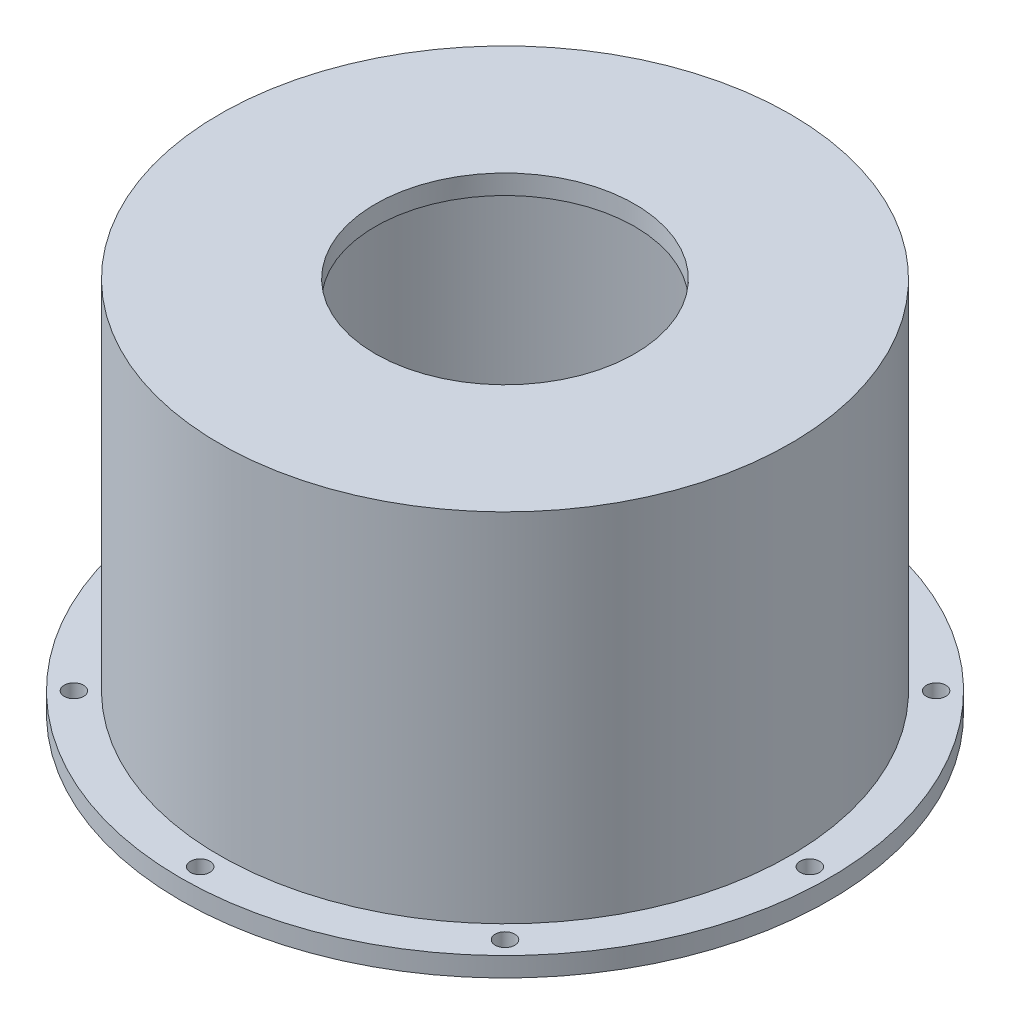
ISO-10303-21;
HEADER;
FILE_DESCRIPTION(('STEP AP214'),'2;1');
FILE_NAME('part.step','',(''),(''),'','','');
FILE_SCHEMA(('AUTOMOTIVE_DESIGN { 1 0 10303 214 1 1 1 1 }'));
ENDSEC;
DATA;
#1=APPLICATION_CONTEXT('core data for automotive mechanical design processes');
#2=APPLICATION_PROTOCOL_DEFINITION('international standard','automotive_design',2000,#1);
#3=PRODUCT_CONTEXT('',#1,'mechanical');
#4=PRODUCT('Part','Part','',(#3));
#5=PRODUCT_RELATED_PRODUCT_CATEGORY('part','',(#4));
#6=PRODUCT_DEFINITION_FORMATION('','',#4);
#7=PRODUCT_DEFINITION_CONTEXT('part definition',#1,'design');
#8=PRODUCT_DEFINITION('design','',#6,#7);
#9=PRODUCT_DEFINITION_SHAPE('','',#8);
#10=(LENGTH_UNIT() NAMED_UNIT(*) SI_UNIT(.MILLI.,.METRE.));
#11=(NAMED_UNIT(*) PLANE_ANGLE_UNIT() SI_UNIT($,.RADIAN.));
#12=(NAMED_UNIT(*) SI_UNIT($,.STERADIAN.) SOLID_ANGLE_UNIT());
#13=UNCERTAINTY_MEASURE_WITH_UNIT(LENGTH_MEASURE(1.E-05),#10,'distance_accuracy_value','');
#14=(GEOMETRIC_REPRESENTATION_CONTEXT(3) GLOBAL_UNCERTAINTY_ASSIGNED_CONTEXT((#13)) GLOBAL_UNIT_ASSIGNED_CONTEXT((#10,
#11,#12)) REPRESENTATION_CONTEXT('',''));
#15=CARTESIAN_POINT('',(0.,0.,0.));
#16=DIRECTION('',(0.,0.,1.));
#17=DIRECTION('',(1.,0.,0.));
#18=AXIS2_PLACEMENT_3D('',#15,#16,#17);
#19=CARTESIAN_POINT('',(0.,58.,0.));
#20=DIRECTION('',(0.,1.,0.));
#21=DIRECTION('',(0.,0.,1.));
#22=AXIS2_PLACEMENT_3D('',#19,#20,#21);
#23=PLANE('',#22);
#24=CARTESIAN_POINT('',(0.,58.,0.));
#25=DIRECTION('',(0.,1.,0.));
#26=DIRECTION('',(0.,0.,1.));
#27=AXIS2_PLACEMENT_3D('',#24,#25,#26);
#28=CIRCLE('',#27,20.);
#29=CARTESIAN_POINT('',(0.,58.,20.));
#30=VERTEX_POINT('',#29);
#31=EDGE_CURVE('E136',#30,#30,#28,.T.);
#32=ORIENTED_EDGE('',*,*,#31,.F.);
#33=EDGE_LOOP('',(#32));
#34=FACE_BOUND('',#33,.T.);
#35=CARTESIAN_POINT('',(0.,58.,0.));
#36=DIRECTION('',(0.,-1.,0.));
#37=DIRECTION('',(0.,0.,-1.));
#38=AXIS2_PLACEMENT_3D('',#35,#36,#37);
#39=CIRCLE('',#38,44.);
#40=CARTESIAN_POINT('',(0.,58.,-44.));
#41=VERTEX_POINT('',#40);
#42=EDGE_CURVE('E10',#41,#41,#39,.T.);
#43=ORIENTED_EDGE('',*,*,#42,.F.);
#44=EDGE_LOOP('',(#43));
#45=FACE_BOUND('',#44,.T.);
#46=ADVANCED_FACE('F41',(#34,#45),#23,.T.);
#47=CARTESIAN_POINT('',(0.,0.,0.));
#48=DIRECTION('',(0.,-1.,0.));
#49=DIRECTION('',(0.,0.,-1.));
#50=AXIS2_PLACEMENT_3D('',#47,#48,#49);
#51=CYLINDRICAL_SURFACE('',#50,44.);
#52=ORIENTED_EDGE('',*,*,#42,.T.);
#53=EDGE_LOOP('',(#52));
#54=FACE_BOUND('',#53,.T.);
#55=CARTESIAN_POINT('',(0.,3.,0.));
#56=DIRECTION('',(0.,-1.,0.));
#57=DIRECTION('',(0.,0.,-1.));
#58=AXIS2_PLACEMENT_3D('',#55,#56,#57);
#59=CIRCLE('',#58,44.);
#60=CARTESIAN_POINT('',(0.,3.,-44.));
#61=VERTEX_POINT('',#60);
#62=EDGE_CURVE('E49',#61,#61,#59,.T.);
#63=ORIENTED_EDGE('',*,*,#62,.F.);
#64=EDGE_LOOP('',(#63));
#65=FACE_BOUND('',#64,.T.);
#66=ADVANCED_FACE('F166',(#54,#65),#51,.T.);
#67=CARTESIAN_POINT('',(44.,3.,0.));
#68=DIRECTION('',(0.,1.,0.));
#69=DIRECTION('',(0.,0.,1.));
#70=AXIS2_PLACEMENT_3D('',#67,#68,#69);
#71=PLANE('',#70);
#72=CARTESIAN_POINT('',(0.,3.,47.));
#73=DIRECTION('',(0.,1.,0.));
#74=DIRECTION('',(0.,0.,1.));
#75=AXIS2_PLACEMENT_3D('',#72,#73,#74);
#76=CIRCLE('',#75,1.5);
#77=CARTESIAN_POINT('',(0.,3.,48.5));
#78=VERTEX_POINT('',#77);
#79=EDGE_CURVE('E129',#78,#78,#76,.T.);
#80=ORIENTED_EDGE('',*,*,#79,.F.);
#81=EDGE_LOOP('',(#80));
#82=FACE_BOUND('',#81,.T.);
#83=CARTESIAN_POINT('',(-33.2340187157677,3.,33.2340187157677));
#84=DIRECTION('',(0.,1.,0.));
#85=DIRECTION('',(0.,0.,1.));
#86=AXIS2_PLACEMENT_3D('',#83,#84,#85);
#87=CIRCLE('',#86,1.5);
#88=CARTESIAN_POINT('',(-33.2340187157677,3.,34.7340187157677));
#89=VERTEX_POINT('',#88);
#90=EDGE_CURVE('E125',#89,#89,#87,.T.);
#91=ORIENTED_EDGE('',*,*,#90,.F.);
#92=EDGE_LOOP('',(#91));
#93=FACE_BOUND('',#92,.T.);
#94=CARTESIAN_POINT('',(-47.,3.,0.));
#95=DIRECTION('',(0.,1.,0.));
#96=DIRECTION('',(0.,0.,1.));
#97=AXIS2_PLACEMENT_3D('',#94,#95,#96);
#98=CIRCLE('',#97,1.5);
#99=CARTESIAN_POINT('',(-47.,3.,1.50000000000001));
#100=VERTEX_POINT('',#99);
#101=EDGE_CURVE('E117',#100,#100,#98,.T.);
#102=ORIENTED_EDGE('',*,*,#101,.F.);
#103=EDGE_LOOP('',(#102));
#104=FACE_BOUND('',#103,.T.);
#105=CARTESIAN_POINT('',(-33.2340187157677,3.,-33.2340187157677));
#106=DIRECTION('',(0.,1.,0.));
#107=DIRECTION('',(0.,0.,1.));
#108=AXIS2_PLACEMENT_3D('',#105,#106,#107);
#109=CIRCLE('',#108,1.5);
#110=CARTESIAN_POINT('',(-33.2340187157677,3.,-31.7340187157677));
#111=VERTEX_POINT('',#110);
#112=EDGE_CURVE('E109',#111,#111,#109,.T.);
#113=ORIENTED_EDGE('',*,*,#112,.F.);
#114=EDGE_LOOP('',(#113));
#115=FACE_BOUND('',#114,.T.);
#116=CARTESIAN_POINT('',(0.,3.,-47.));
#117=DIRECTION('',(0.,1.,0.));
#118=DIRECTION('',(0.,0.,1.));
#119=AXIS2_PLACEMENT_3D('',#116,#117,#118);
#120=CIRCLE('',#119,1.5);
#121=CARTESIAN_POINT('',(0.,3.,-45.5));
#122=VERTEX_POINT('',#121);
#123=EDGE_CURVE('E101',#122,#122,#120,.T.);
#124=ORIENTED_EDGE('',*,*,#123,.F.);
#125=EDGE_LOOP('',(#124));
#126=FACE_BOUND('',#125,.T.);
#127=CARTESIAN_POINT('',(33.2340187157677,3.,-33.2340187157677));
#128=DIRECTION('',(0.,1.,0.));
#129=DIRECTION('',(0.,0.,1.));
#130=AXIS2_PLACEMENT_3D('',#127,#128,#129);
#131=CIRCLE('',#130,1.5);
#132=CARTESIAN_POINT('',(33.2340187157677,3.,-31.7340187157677));
#133=VERTEX_POINT('',#132);
#134=EDGE_CURVE('E93',#133,#133,#131,.T.);
#135=ORIENTED_EDGE('',*,*,#134,.F.);
#136=EDGE_LOOP('',(#135));
#137=FACE_BOUND('',#136,.T.);
#138=CARTESIAN_POINT('',(47.,3.,0.));
#139=DIRECTION('',(0.,1.,0.));
#140=DIRECTION('',(0.,0.,1.));
#141=AXIS2_PLACEMENT_3D('',#138,#139,#140);
#142=CIRCLE('',#141,1.5);
#143=CARTESIAN_POINT('',(47.,3.,1.49999999999999));
#144=VERTEX_POINT('',#143);
#145=EDGE_CURVE('E85',#144,#144,#142,.T.);
#146=ORIENTED_EDGE('',*,*,#145,.F.);
#147=EDGE_LOOP('',(#146));
#148=FACE_BOUND('',#147,.T.);
#149=CARTESIAN_POINT('',(33.2340187157677,3.,33.2340187157677));
#150=DIRECTION('',(0.,1.,0.));
#151=DIRECTION('',(0.,0.,1.));
#152=AXIS2_PLACEMENT_3D('',#149,#150,#151);
#153=CIRCLE('',#152,1.5);
#154=CARTESIAN_POINT('',(33.2340187157677,3.,34.7340187157677));
#155=VERTEX_POINT('',#154);
#156=EDGE_CURVE('E77',#155,#155,#153,.T.);
#157=ORIENTED_EDGE('',*,*,#156,.F.);
#158=EDGE_LOOP('',(#157));
#159=FACE_BOUND('',#158,.T.);
#160=ORIENTED_EDGE('',*,*,#62,.T.);
#161=EDGE_LOOP('',(#160));
#162=FACE_BOUND('',#161,.T.);
#163=CARTESIAN_POINT('',(0.,3.,0.));
#164=DIRECTION('',(0.,-1.,0.));
#165=DIRECTION('',(0.,0.,-1.));
#166=AXIS2_PLACEMENT_3D('',#163,#164,#165);
#167=CIRCLE('',#166,50.);
#168=CARTESIAN_POINT('',(0.,3.,-50.));
#169=VERTEX_POINT('',#168);
#170=EDGE_CURVE('E54',#169,#169,#167,.T.);
#171=ORIENTED_EDGE('',*,*,#170,.F.);
#172=EDGE_LOOP('',(#171));
#173=FACE_BOUND('',#172,.T.);
#174=ADVANCED_FACE('F171',(#82,#93,#104,#115,#126,#137,#148,#159,#162,#173),#71,.T.);
#175=CARTESIAN_POINT('',(0.,0.,0.));
#176=DIRECTION('',(0.,-1.,0.));
#177=DIRECTION('',(0.,0.,-1.));
#178=AXIS2_PLACEMENT_3D('',#175,#176,#177);
#179=CYLINDRICAL_SURFACE('',#178,50.);
#180=ORIENTED_EDGE('',*,*,#170,.T.);
#181=EDGE_LOOP('',(#180));
#182=FACE_BOUND('',#181,.T.);
#183=CARTESIAN_POINT('',(0.,0.,0.));
#184=DIRECTION('',(0.,-1.,0.));
#185=DIRECTION('',(0.,0.,-1.));
#186=AXIS2_PLACEMENT_3D('',#183,#184,#185);
#187=CIRCLE('',#186,50.);
#188=CARTESIAN_POINT('',(0.,0.,-50.));
#189=VERTEX_POINT('',#188);
#190=EDGE_CURVE('E60',#189,#189,#187,.T.);
#191=ORIENTED_EDGE('',*,*,#190,.F.);
#192=EDGE_LOOP('',(#191));
#193=FACE_BOUND('',#192,.T.);
#194=ADVANCED_FACE('F162',(#182,#193),#179,.T.);
#195=CARTESIAN_POINT('',(50.,0.,0.));
#196=DIRECTION('',(0.,-1.,0.));
#197=DIRECTION('',(0.,0.,-1.));
#198=AXIS2_PLACEMENT_3D('',#195,#196,#197);
#199=PLANE('',#198);
#200=CARTESIAN_POINT('',(0.,0.,47.));
#201=DIRECTION('',(0.,1.,0.));
#202=DIRECTION('',(0.,0.,1.));
#203=AXIS2_PLACEMENT_3D('',#200,#201,#202);
#204=CIRCLE('',#203,1.5);
#205=CARTESIAN_POINT('',(0.,0.,48.5));
#206=VERTEX_POINT('',#205);
#207=EDGE_CURVE('E72',#206,#206,#204,.T.);
#208=ORIENTED_EDGE('',*,*,#207,.T.);
#209=EDGE_LOOP('',(#208));
#210=FACE_BOUND('',#209,.T.);
#211=CARTESIAN_POINT('',(-33.2340187157677,0.,33.2340187157677));
#212=DIRECTION('',(0.,1.,0.));
#213=DIRECTION('',(0.,0.,1.));
#214=AXIS2_PLACEMENT_3D('',#211,#212,#213);
#215=CIRCLE('',#214,1.5);
#216=CARTESIAN_POINT('',(-33.2340187157677,0.,34.7340187157677));
#217=VERTEX_POINT('',#216);
#218=EDGE_CURVE('E121',#217,#217,#215,.T.);
#219=ORIENTED_EDGE('',*,*,#218,.T.);
#220=EDGE_LOOP('',(#219));
#221=FACE_BOUND('',#220,.T.);
#222=CARTESIAN_POINT('',(-47.,0.,0.));
#223=DIRECTION('',(0.,1.,0.));
#224=DIRECTION('',(0.,0.,1.));
#225=AXIS2_PLACEMENT_3D('',#222,#223,#224);
#226=CIRCLE('',#225,1.5);
#227=CARTESIAN_POINT('',(-47.,0.,1.50000000000001));
#228=VERTEX_POINT('',#227);
#229=EDGE_CURVE('E113',#228,#228,#226,.T.);
#230=ORIENTED_EDGE('',*,*,#229,.T.);
#231=EDGE_LOOP('',(#230));
#232=FACE_BOUND('',#231,.T.);
#233=CARTESIAN_POINT('',(-33.2340187157677,0.,-33.2340187157677));
#234=DIRECTION('',(0.,1.,0.));
#235=DIRECTION('',(0.,0.,1.));
#236=AXIS2_PLACEMENT_3D('',#233,#234,#235);
#237=CIRCLE('',#236,1.5);
#238=CARTESIAN_POINT('',(-33.2340187157677,0.,-31.7340187157677));
#239=VERTEX_POINT('',#238);
#240=EDGE_CURVE('E105',#239,#239,#237,.T.);
#241=ORIENTED_EDGE('',*,*,#240,.T.);
#242=EDGE_LOOP('',(#241));
#243=FACE_BOUND('',#242,.T.);
#244=CARTESIAN_POINT('',(0.,0.,-47.));
#245=DIRECTION('',(0.,1.,0.));
#246=DIRECTION('',(0.,0.,1.));
#247=AXIS2_PLACEMENT_3D('',#244,#245,#246);
#248=CIRCLE('',#247,1.5);
#249=CARTESIAN_POINT('',(0.,0.,-45.5));
#250=VERTEX_POINT('',#249);
#251=EDGE_CURVE('E97',#250,#250,#248,.T.);
#252=ORIENTED_EDGE('',*,*,#251,.T.);
#253=EDGE_LOOP('',(#252));
#254=FACE_BOUND('',#253,.T.);
#255=CARTESIAN_POINT('',(33.2340187157677,0.,-33.2340187157677));
#256=DIRECTION('',(0.,1.,0.));
#257=DIRECTION('',(0.,0.,1.));
#258=AXIS2_PLACEMENT_3D('',#255,#256,#257);
#259=CIRCLE('',#258,1.5);
#260=CARTESIAN_POINT('',(33.2340187157677,0.,-31.7340187157677));
#261=VERTEX_POINT('',#260);
#262=EDGE_CURVE('E89',#261,#261,#259,.T.);
#263=ORIENTED_EDGE('',*,*,#262,.T.);
#264=EDGE_LOOP('',(#263));
#265=FACE_BOUND('',#264,.T.);
#266=CARTESIAN_POINT('',(47.,0.,0.));
#267=DIRECTION('',(0.,1.,0.));
#268=DIRECTION('',(0.,0.,1.));
#269=AXIS2_PLACEMENT_3D('',#266,#267,#268);
#270=CIRCLE('',#269,1.5);
#271=CARTESIAN_POINT('',(47.,0.,1.49999999999999));
#272=VERTEX_POINT('',#271);
#273=EDGE_CURVE('E81',#272,#272,#270,.T.);
#274=ORIENTED_EDGE('',*,*,#273,.T.);
#275=EDGE_LOOP('',(#274));
#276=FACE_BOUND('',#275,.T.);
#277=CARTESIAN_POINT('',(33.2340187157677,0.,33.2340187157677));
#278=DIRECTION('',(0.,1.,0.));
#279=DIRECTION('',(0.,0.,1.));
#280=AXIS2_PLACEMENT_3D('',#277,#278,#279);
#281=CIRCLE('',#280,1.5);
#282=CARTESIAN_POINT('',(33.2340187157677,0.,34.7340187157677));
#283=VERTEX_POINT('',#282);
#284=EDGE_CURVE('E73',#283,#283,#281,.T.);
#285=ORIENTED_EDGE('',*,*,#284,.T.);
#286=EDGE_LOOP('',(#285));
#287=FACE_BOUND('',#286,.T.);
#288=ORIENTED_EDGE('',*,*,#190,.T.);
#289=EDGE_LOOP('',(#288));
#290=FACE_BOUND('',#289,.T.);
#291=CARTESIAN_POINT('',(0.,0.,0.));
#292=DIRECTION('',(0.,-1.,0.));
#293=DIRECTION('',(0.,0.,-1.));
#294=AXIS2_PLACEMENT_3D('',#291,#292,#293);
#295=CIRCLE('',#294,41.5);
#296=CARTESIAN_POINT('',(0.,0.,-41.5));
#297=VERTEX_POINT('',#296);
#298=EDGE_CURVE('E64',#297,#297,#295,.T.);
#299=ORIENTED_EDGE('',*,*,#298,.F.);
#300=EDGE_LOOP('',(#299));
#301=FACE_BOUND('',#300,.T.);
#302=ADVANCED_FACE('F156',(#210,#221,#232,#243,#254,#265,#276,#287,#290,#301),#199,.T.);
#303=CARTESIAN_POINT('',(0.,0.,0.));
#304=DIRECTION('',(0.,-1.,0.));
#305=DIRECTION('',(0.,0.,-1.));
#306=AXIS2_PLACEMENT_3D('',#303,#304,#305);
#307=CYLINDRICAL_SURFACE('',#306,41.5);
#308=ORIENTED_EDGE('',*,*,#298,.T.);
#309=EDGE_LOOP('',(#308));
#310=FACE_BOUND('',#309,.T.);
#311=CARTESIAN_POINT('',(0.,55.,0.));
#312=DIRECTION('',(0.,-1.,0.));
#313=DIRECTION('',(0.,0.,-1.));
#314=AXIS2_PLACEMENT_3D('',#311,#312,#313);
#315=CIRCLE('',#314,41.5);
#316=CARTESIAN_POINT('',(0.,55.,-41.5));
#317=VERTEX_POINT('',#316);
#318=EDGE_CURVE('E68',#317,#317,#315,.T.);
#319=ORIENTED_EDGE('',*,*,#318,.F.);
#320=EDGE_LOOP('',(#319));
#321=FACE_BOUND('',#320,.T.);
#322=ADVANCED_FACE('F151',(#310,#321),#307,.F.);
#323=CARTESIAN_POINT('',(41.5,55.,0.));
#324=DIRECTION('',(0.,-1.,0.));
#325=DIRECTION('',(0.,0.,-1.));
#326=AXIS2_PLACEMENT_3D('',#323,#324,#325);
#327=PLANE('',#326);
#328=CARTESIAN_POINT('',(0.,55.,0.));
#329=DIRECTION('',(0.,-1.,0.));
#330=DIRECTION('',(0.,0.,-1.));
#331=AXIS2_PLACEMENT_3D('',#328,#329,#330);
#332=CIRCLE('',#331,20.);
#333=CARTESIAN_POINT('',(0.,55.,-20.));
#334=VERTEX_POINT('',#333);
#335=EDGE_CURVE('E44',#334,#334,#332,.T.);
#336=ORIENTED_EDGE('',*,*,#335,.F.);
#337=EDGE_LOOP('',(#336));
#338=FACE_BOUND('',#337,.T.);
#339=ORIENTED_EDGE('',*,*,#318,.T.);
#340=EDGE_LOOP('',(#339));
#341=FACE_BOUND('',#340,.T.);
#342=ADVANCED_FACE('F147',(#338,#341),#327,.T.);
#343=CARTESIAN_POINT('',(33.2340187157677,0.,33.2340187157677));
#344=DIRECTION('',(0.,1.,0.));
#345=DIRECTION('',(0.,0.,1.));
#346=AXIS2_PLACEMENT_3D('',#343,#344,#345);
#347=CYLINDRICAL_SURFACE('',#346,1.5);
#348=ORIENTED_EDGE('',*,*,#284,.F.);
#349=EDGE_LOOP('',(#348));
#350=FACE_BOUND('',#349,.T.);
#351=ORIENTED_EDGE('',*,*,#156,.T.);
#352=EDGE_LOOP('',(#351));
#353=FACE_BOUND('',#352,.T.);
#354=ADVANCED_FACE('F150',(#350,#353),#347,.F.);
#355=CARTESIAN_POINT('',(47.,0.,0.));
#356=DIRECTION('',(0.,1.,0.));
#357=DIRECTION('',(0.,0.,1.));
#358=AXIS2_PLACEMENT_3D('',#355,#356,#357);
#359=CYLINDRICAL_SURFACE('',#358,1.5);
#360=ORIENTED_EDGE('',*,*,#273,.F.);
#361=EDGE_LOOP('',(#360));
#362=FACE_BOUND('',#361,.T.);
#363=ORIENTED_EDGE('',*,*,#145,.T.);
#364=EDGE_LOOP('',(#363));
#365=FACE_BOUND('',#364,.T.);
#366=ADVANCED_FACE('F210',(#362,#365),#359,.F.);
#367=CARTESIAN_POINT('',(33.2340187157677,0.,-33.2340187157677));
#368=DIRECTION('',(0.,1.,0.));
#369=DIRECTION('',(0.,0.,1.));
#370=AXIS2_PLACEMENT_3D('',#367,#368,#369);
#371=CYLINDRICAL_SURFACE('',#370,1.5);
#372=ORIENTED_EDGE('',*,*,#262,.F.);
#373=EDGE_LOOP('',(#372));
#374=FACE_BOUND('',#373,.T.);
#375=ORIENTED_EDGE('',*,*,#134,.T.);
#376=EDGE_LOOP('',(#375));
#377=FACE_BOUND('',#376,.T.);
#378=ADVANCED_FACE('F222',(#374,#377),#371,.F.);
#379=CARTESIAN_POINT('',(0.,0.,-47.));
#380=DIRECTION('',(0.,1.,0.));
#381=DIRECTION('',(0.,0.,1.));
#382=AXIS2_PLACEMENT_3D('',#379,#380,#381);
#383=CYLINDRICAL_SURFACE('',#382,1.5);
#384=ORIENTED_EDGE('',*,*,#251,.F.);
#385=EDGE_LOOP('',(#384));
#386=FACE_BOUND('',#385,.T.);
#387=ORIENTED_EDGE('',*,*,#123,.T.);
#388=EDGE_LOOP('',(#387));
#389=FACE_BOUND('',#388,.T.);
#390=ADVANCED_FACE('F233',(#386,#389),#383,.F.);
#391=CARTESIAN_POINT('',(-33.2340187157677,0.,-33.2340187157677));
#392=DIRECTION('',(0.,1.,0.));
#393=DIRECTION('',(0.,0.,1.));
#394=AXIS2_PLACEMENT_3D('',#391,#392,#393);
#395=CYLINDRICAL_SURFACE('',#394,1.5);
#396=ORIENTED_EDGE('',*,*,#240,.F.);
#397=EDGE_LOOP('',(#396));
#398=FACE_BOUND('',#397,.T.);
#399=ORIENTED_EDGE('',*,*,#112,.T.);
#400=EDGE_LOOP('',(#399));
#401=FACE_BOUND('',#400,.T.);
#402=ADVANCED_FACE('F244',(#398,#401),#395,.F.);
#403=CARTESIAN_POINT('',(-47.,0.,0.));
#404=DIRECTION('',(0.,1.,0.));
#405=DIRECTION('',(0.,0.,1.));
#406=AXIS2_PLACEMENT_3D('',#403,#404,#405);
#407=CYLINDRICAL_SURFACE('',#406,1.5);
#408=ORIENTED_EDGE('',*,*,#229,.F.);
#409=EDGE_LOOP('',(#408));
#410=FACE_BOUND('',#409,.T.);
#411=ORIENTED_EDGE('',*,*,#101,.T.);
#412=EDGE_LOOP('',(#411));
#413=FACE_BOUND('',#412,.T.);
#414=ADVANCED_FACE('F255',(#410,#413),#407,.F.);
#415=CARTESIAN_POINT('',(-33.2340187157677,0.,33.2340187157677));
#416=DIRECTION('',(0.,1.,0.));
#417=DIRECTION('',(0.,0.,1.));
#418=AXIS2_PLACEMENT_3D('',#415,#416,#417);
#419=CYLINDRICAL_SURFACE('',#418,1.5);
#420=ORIENTED_EDGE('',*,*,#218,.F.);
#421=EDGE_LOOP('',(#420));
#422=FACE_BOUND('',#421,.T.);
#423=ORIENTED_EDGE('',*,*,#90,.T.);
#424=EDGE_LOOP('',(#423));
#425=FACE_BOUND('',#424,.T.);
#426=ADVANCED_FACE('F266',(#422,#425),#419,.F.);
#427=CARTESIAN_POINT('',(0.,0.,47.));
#428=DIRECTION('',(0.,1.,0.));
#429=DIRECTION('',(0.,0.,1.));
#430=AXIS2_PLACEMENT_3D('',#427,#428,#429);
#431=CYLINDRICAL_SURFACE('',#430,1.5);
#432=ORIENTED_EDGE('',*,*,#207,.F.);
#433=EDGE_LOOP('',(#432));
#434=FACE_BOUND('',#433,.T.);
#435=ORIENTED_EDGE('',*,*,#79,.T.);
#436=EDGE_LOOP('',(#435));
#437=FACE_BOUND('',#436,.T.);
#438=ADVANCED_FACE('F277',(#434,#437),#431,.F.);
#439=CARTESIAN_POINT('',(0.,0.,0.));
#440=DIRECTION('',(0.,1.,0.));
#441=DIRECTION('',(0.,0.,1.));
#442=AXIS2_PLACEMENT_3D('',#439,#440,#441);
#443=CYLINDRICAL_SURFACE('',#442,20.);
#444=ORIENTED_EDGE('',*,*,#335,.T.);
#445=EDGE_LOOP('',(#444));
#446=FACE_BOUND('',#445,.T.);
#447=ORIENTED_EDGE('',*,*,#31,.T.);
#448=EDGE_LOOP('',(#447));
#449=FACE_BOUND('',#448,.T.);
#450=ADVANCED_FACE('F145',(#446,#449),#443,.F.);
#451=CLOSED_SHELL('',(#46,#66,#174,#194,#302,#322,#342,#354,#366,#378,#390,#402,#414,#426,#438,#450));
#452=MANIFOLD_SOLID_BREP('B2',#451);
#453=ADVANCED_BREP_SHAPE_REPRESENTATION('',(#18,#452),#14);
#454=SHAPE_DEFINITION_REPRESENTATION(#9,#453);
ENDSEC;
END-ISO-10303-21;
